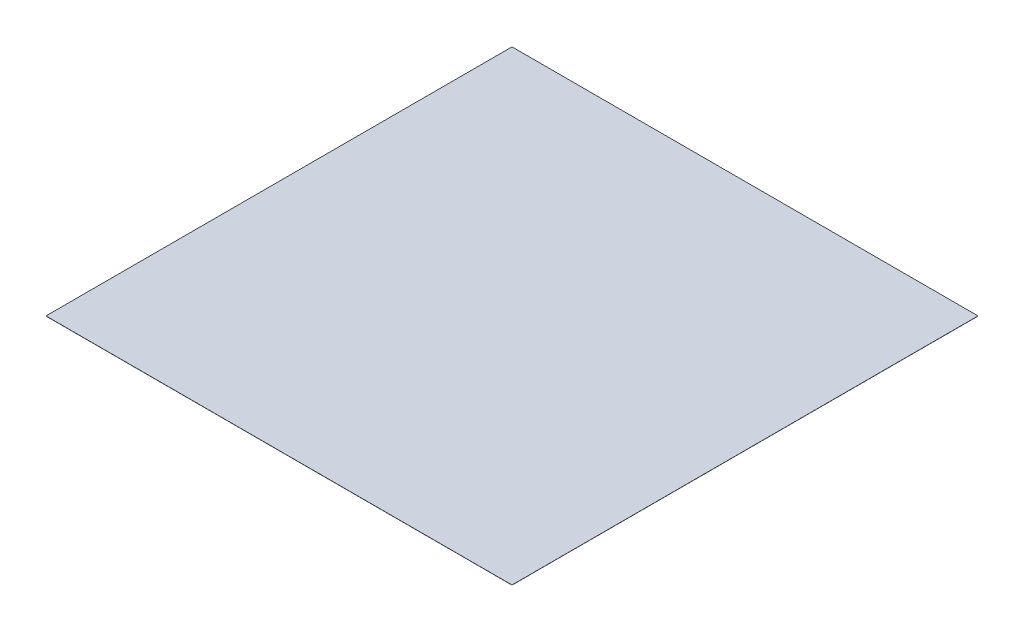
ISO-10303-21;
HEADER;
FILE_DESCRIPTION(('STEP AP214'),'2;1');
FILE_NAME('part.step','',(''),(''),'','','');
FILE_SCHEMA(('AUTOMOTIVE_DESIGN { 1 0 10303 214 1 1 1 1 }'));
ENDSEC;
DATA;
#1=APPLICATION_CONTEXT('core data for automotive mechanical design processes');
#2=APPLICATION_PROTOCOL_DEFINITION('international standard','automotive_design',2000,#1);
#3=PRODUCT_CONTEXT('',#1,'mechanical');
#4=PRODUCT('Part','Part','',(#3));
#5=PRODUCT_RELATED_PRODUCT_CATEGORY('part','',(#4));
#6=PRODUCT_DEFINITION_FORMATION('','',#4);
#7=PRODUCT_DEFINITION_CONTEXT('part definition',#1,'design');
#8=PRODUCT_DEFINITION('design','',#6,#7);
#9=PRODUCT_DEFINITION_SHAPE('','',#8);
#10=(LENGTH_UNIT() NAMED_UNIT(*) SI_UNIT(.MILLI.,.METRE.));
#11=(NAMED_UNIT(*) PLANE_ANGLE_UNIT() SI_UNIT($,.RADIAN.));
#12=(NAMED_UNIT(*) SI_UNIT($,.STERADIAN.) SOLID_ANGLE_UNIT());
#13=UNCERTAINTY_MEASURE_WITH_UNIT(LENGTH_MEASURE(1.E-05),#10,'distance_accuracy_value','');
#14=(GEOMETRIC_REPRESENTATION_CONTEXT(3) GLOBAL_UNCERTAINTY_ASSIGNED_CONTEXT((#13)) GLOBAL_UNIT_ASSIGNED_CONTEXT((#10,
#11,#12)) REPRESENTATION_CONTEXT('',''));
#15=CARTESIAN_POINT('',(0.,0.,0.));
#16=DIRECTION('',(0.,0.,1.));
#17=DIRECTION('',(1.,0.,0.));
#18=AXIS2_PLACEMENT_3D('',#15,#16,#17);
#19=CARTESIAN_POINT('',(-864.212221256616,0.01,-399.524350277297));
#20=DIRECTION('',(1.,0.,0.));
#21=DIRECTION('',(0.,0.,-1.));
#22=AXIS2_PLACEMENT_3D('',#19,#20,#21);
#23=PLANE('',#22);
#24=DIRECTION('',(0.,0.,1.));
#25=VECTOR('',#24,1.);
#26=CARTESIAN_POINT('',(-864.212221256616,0.,-399.524350277297));
#27=LINE('',#26,#25);
#28=CARTESIAN_POINT('',(-864.212221256616,0.,-399.524350277297));
#29=VERTEX_POINT('',#28);
#30=CARTESIAN_POINT('',(-864.212221256616,0.,-369.524350277297));
#31=VERTEX_POINT('',#30);
#32=EDGE_CURVE('E110',#29,#31,#27,.T.);
#33=ORIENTED_EDGE('',*,*,#32,.F.);
#34=DIRECTION('',(0.,-1.,0.));
#35=VECTOR('',#34,1.);
#36=CARTESIAN_POINT('',(-864.212221256616,0.01,-399.524350277297));
#37=LINE('',#36,#35);
#38=CARTESIAN_POINT('',(-864.212221256616,0.01,-399.524350277297));
#39=VERTEX_POINT('',#38);
#40=EDGE_CURVE('E11',#39,#29,#37,.T.);
#41=ORIENTED_EDGE('',*,*,#40,.F.);
#42=DIRECTION('',(0.,0.,1.));
#43=VECTOR('',#42,1.);
#44=CARTESIAN_POINT('',(-864.212221256616,0.01,-399.524350277297));
#45=LINE('',#44,#43);
#46=CARTESIAN_POINT('',(-864.212221256616,0.01,-369.524350277297));
#47=VERTEX_POINT('',#46);
#48=EDGE_CURVE('E103',#39,#47,#45,.T.);
#49=ORIENTED_EDGE('',*,*,#48,.T.);
#50=DIRECTION('',(0.,-1.,0.));
#51=VECTOR('',#50,1.);
#52=CARTESIAN_POINT('',(-864.212221256616,0.01,-369.524350277297));
#53=LINE('',#52,#51);
#54=EDGE_CURVE('E42',#47,#31,#53,.T.);
#55=ORIENTED_EDGE('',*,*,#54,.T.);
#56=EDGE_LOOP('',(#33,#41,#49,#55));
#57=FACE_BOUND('',#56,.T.);
#58=ADVANCED_FACE('F39',(#57),#23,.T.);
#59=CARTESIAN_POINT('',(-864.212221256616,0.01,-399.524350277297));
#60=DIRECTION('',(0.,0.,1.));
#61=DIRECTION('',(1.,0.,0.));
#62=AXIS2_PLACEMENT_3D('',#59,#60,#61);
#63=PLANE('',#62);
#64=DIRECTION('',(-1.,0.,0.));
#65=VECTOR('',#64,1.);
#66=CARTESIAN_POINT('',(-864.212221256616,0.,-399.524350277297));
#67=LINE('',#66,#65);
#68=CARTESIAN_POINT('',(-894.212221256616,0.,-399.524350277297));
#69=VERTEX_POINT('',#68);
#70=EDGE_CURVE('E73',#29,#69,#67,.T.);
#71=ORIENTED_EDGE('',*,*,#70,.T.);
#72=DIRECTION('',(0.,-1.,0.));
#73=VECTOR('',#72,1.);
#74=CARTESIAN_POINT('',(-894.212221256616,0.01,-399.524350277297));
#75=LINE('',#74,#73);
#76=CARTESIAN_POINT('',(-894.212221256616,0.01,-399.524350277297));
#77=VERTEX_POINT('',#76);
#78=EDGE_CURVE('E49',#77,#69,#75,.T.);
#79=ORIENTED_EDGE('',*,*,#78,.F.);
#80=DIRECTION('',(-1.,0.,0.));
#81=VECTOR('',#80,1.);
#82=CARTESIAN_POINT('',(-864.212221256616,0.01,-399.524350277297));
#83=LINE('',#82,#81);
#84=EDGE_CURVE('E90',#39,#77,#83,.T.);
#85=ORIENTED_EDGE('',*,*,#84,.F.);
#86=ORIENTED_EDGE('',*,*,#40,.T.);
#87=EDGE_LOOP('',(#71,#79,#85,#86));
#88=FACE_BOUND('',#87,.T.);
#89=ADVANCED_FACE('F126',(#88),#63,.F.);
#90=CARTESIAN_POINT('',(-894.212221256616,0.01,-399.524350277297));
#91=DIRECTION('',(1.,0.,0.));
#92=DIRECTION('',(0.,0.,-1.));
#93=AXIS2_PLACEMENT_3D('',#90,#91,#92);
#94=PLANE('',#93);
#95=DIRECTION('',(0.,0.,1.));
#96=VECTOR('',#95,1.);
#97=CARTESIAN_POINT('',(-894.212221256616,0.,-399.524350277297));
#98=LINE('',#97,#96);
#99=CARTESIAN_POINT('',(-894.212221256616,0.,-369.524350277297));
#100=VERTEX_POINT('',#99);
#101=EDGE_CURVE('E98',#69,#100,#98,.T.);
#102=ORIENTED_EDGE('',*,*,#101,.T.);
#103=DIRECTION('',(0.,-1.,0.));
#104=VECTOR('',#103,1.);
#105=CARTESIAN_POINT('',(-894.212221256616,0.01,-369.524350277297));
#106=LINE('',#105,#104);
#107=CARTESIAN_POINT('',(-894.212221256616,0.01,-369.524350277297));
#108=VERTEX_POINT('',#107);
#109=EDGE_CURVE('E95',#108,#100,#106,.T.);
#110=ORIENTED_EDGE('',*,*,#109,.F.);
#111=DIRECTION('',(0.,0.,1.));
#112=VECTOR('',#111,1.);
#113=CARTESIAN_POINT('',(-894.212221256616,0.01,-399.524350277297));
#114=LINE('',#113,#112);
#115=EDGE_CURVE('E85',#77,#108,#114,.T.);
#116=ORIENTED_EDGE('',*,*,#115,.F.);
#117=ORIENTED_EDGE('',*,*,#78,.T.);
#118=EDGE_LOOP('',(#102,#110,#116,#117));
#119=FACE_BOUND('',#118,.T.);
#120=ADVANCED_FACE('F96',(#119),#94,.F.);
#121=CARTESIAN_POINT('',(-864.212221256616,0.01,-369.524350277297));
#122=DIRECTION('',(0.,0.,1.));
#123=DIRECTION('',(1.,0.,0.));
#124=AXIS2_PLACEMENT_3D('',#121,#122,#123);
#125=PLANE('',#124);
#126=DIRECTION('',(-1.,0.,0.));
#127=VECTOR('',#126,1.);
#128=CARTESIAN_POINT('',(-864.212221256616,0.,-369.524350277297));
#129=LINE('',#128,#127);
#130=EDGE_CURVE('E114',#31,#100,#129,.T.);
#131=ORIENTED_EDGE('',*,*,#130,.F.);
#132=ORIENTED_EDGE('',*,*,#54,.F.);
#133=DIRECTION('',(-1.,0.,0.));
#134=VECTOR('',#133,1.);
#135=CARTESIAN_POINT('',(-864.212221256616,0.01,-369.524350277297));
#136=LINE('',#135,#134);
#137=EDGE_CURVE('E89',#47,#108,#136,.T.);
#138=ORIENTED_EDGE('',*,*,#137,.T.);
#139=ORIENTED_EDGE('',*,*,#109,.T.);
#140=EDGE_LOOP('',(#131,#132,#138,#139));
#141=FACE_BOUND('',#140,.T.);
#142=ADVANCED_FACE('F101',(#141),#125,.T.);
#143=CARTESIAN_POINT('',(0.,0.01,0.));
#144=DIRECTION('',(0.,-1.,0.));
#145=DIRECTION('',(0.,0.,-1.));
#146=AXIS2_PLACEMENT_3D('',#143,#144,#145);
#147=PLANE('',#146);
#148=ORIENTED_EDGE('',*,*,#48,.F.);
#149=ORIENTED_EDGE('',*,*,#84,.T.);
#150=ORIENTED_EDGE('',*,*,#115,.T.);
#151=ORIENTED_EDGE('',*,*,#137,.F.);
#152=EDGE_LOOP('',(#148,#149,#150,#151));
#153=FACE_BOUND('',#152,.T.);
#154=ADVANCED_FACE('F88',(#153),#147,.F.);
#155=CARTESIAN_POINT('',(0.,0.,0.));
#156=DIRECTION('',(0.,-1.,0.));
#157=DIRECTION('',(0.,0.,-1.));
#158=AXIS2_PLACEMENT_3D('',#155,#156,#157);
#159=PLANE('',#158);
#160=ORIENTED_EDGE('',*,*,#32,.T.);
#161=ORIENTED_EDGE('',*,*,#130,.T.);
#162=ORIENTED_EDGE('',*,*,#101,.F.);
#163=ORIENTED_EDGE('',*,*,#70,.F.);
#164=EDGE_LOOP('',(#160,#161,#162,#163));
#165=FACE_BOUND('',#164,.T.);
#166=ADVANCED_FACE('F123',(#165),#159,.T.);
#167=CLOSED_SHELL('',(#58,#89,#120,#142,#154,#166));
#168=MANIFOLD_SOLID_BREP('B2',#167);
#169=ADVANCED_BREP_SHAPE_REPRESENTATION('',(#18,#168),#14);
#170=SHAPE_DEFINITION_REPRESENTATION(#9,#169);
ENDSEC;
END-ISO-10303-21;
